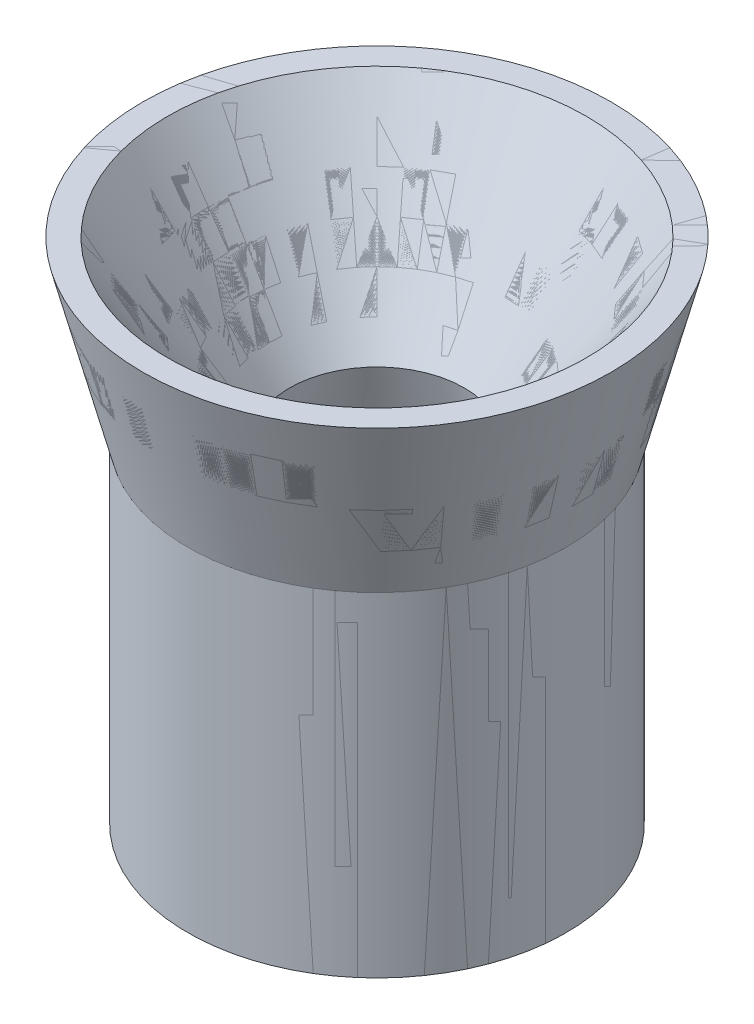
ISO-10303-21;
HEADER;
FILE_DESCRIPTION(('STEP AP214'),'2;1');
FILE_NAME('part.step','',(''),(''),'','','');
FILE_SCHEMA(('AUTOMOTIVE_DESIGN { 1 0 10303 214 1 1 1 1 }'));
ENDSEC;
DATA;
#1=APPLICATION_CONTEXT('core data for automotive mechanical design processes');
#2=APPLICATION_PROTOCOL_DEFINITION('international standard','automotive_design',2000,#1);
#3=PRODUCT_CONTEXT('',#1,'mechanical');
#4=PRODUCT('Part','Part','',(#3));
#5=PRODUCT_RELATED_PRODUCT_CATEGORY('part','',(#4));
#6=PRODUCT_DEFINITION_FORMATION('','',#4);
#7=PRODUCT_DEFINITION_CONTEXT('part definition',#1,'design');
#8=PRODUCT_DEFINITION('design','',#6,#7);
#9=PRODUCT_DEFINITION_SHAPE('','',#8);
#10=(LENGTH_UNIT() NAMED_UNIT(*) SI_UNIT(.MILLI.,.METRE.));
#11=(NAMED_UNIT(*) PLANE_ANGLE_UNIT() SI_UNIT($,.RADIAN.));
#12=(NAMED_UNIT(*) SI_UNIT($,.STERADIAN.) SOLID_ANGLE_UNIT());
#13=UNCERTAINTY_MEASURE_WITH_UNIT(LENGTH_MEASURE(1.E-05),#10,'distance_accuracy_value','');
#14=(GEOMETRIC_REPRESENTATION_CONTEXT(3) GLOBAL_UNCERTAINTY_ASSIGNED_CONTEXT((#13)) GLOBAL_UNIT_ASSIGNED_CONTEXT((#10,
#11,#12)) REPRESENTATION_CONTEXT('',''));
#15=CARTESIAN_POINT('',(0.,0.,0.));
#16=DIRECTION('',(0.,0.,1.));
#17=DIRECTION('',(1.,0.,0.));
#18=AXIS2_PLACEMENT_3D('',#15,#16,#17);
#19=CARTESIAN_POINT('',(0.,-76.2,0.));
#20=DIRECTION('',(0.,-1.,0.));
#21=DIRECTION('',(0.,0.,-1.));
#22=AXIS2_PLACEMENT_3D('',#19,#20,#21);
#23=CONICAL_SURFACE('',#22,36.1358099992551,0.209439510239313);
#24=CARTESIAN_POINT('',(0.,0.,0.));
#25=DIRECTION('',(0.,-1.,0.));
#26=DIRECTION('',(0.,0.,-1.));
#27=AXIS2_PLACEMENT_3D('',#24,#25,#26);
#28=CIRCLE('',#27,19.939);
#29=CARTESIAN_POINT('',(0.,0.,-19.939));
#30=VERTEX_POINT('',#29);
#31=EDGE_CURVE('E11',#30,#30,#28,.T.);
#32=ORIENTED_EDGE('',*,*,#31,.F.);
#33=EDGE_LOOP('',(#32));
#34=FACE_BOUND('',#33,.T.);
#35=CARTESIAN_POINT('',(0.,-76.2,0.));
#36=DIRECTION('',(0.,-1.,0.));
#37=DIRECTION('',(0.,0.,-1.));
#38=AXIS2_PLACEMENT_3D('',#35,#36,#37);
#39=CIRCLE('',#38,36.1358099992551);
#40=CARTESIAN_POINT('',(0.,-76.2,-36.1358099992551));
#41=VERTEX_POINT('',#40);
#42=EDGE_CURVE('E70',#41,#41,#39,.T.);
#43=ORIENTED_EDGE('',*,*,#42,.T.);
#44=EDGE_LOOP('',(#43));
#45=FACE_BOUND('',#44,.T.);
#46=ADVANCED_FACE('F48',(#34,#45),#23,.F.);
#47=CARTESIAN_POINT('',(0.,0.,0.));
#48=DIRECTION('',(0.,1.,0.));
#49=DIRECTION('',(0.,0.,1.));
#50=AXIS2_PLACEMENT_3D('',#47,#48,#49);
#51=CONICAL_SURFACE('',#50,19.939,0.610865238198017);
#52=CARTESIAN_POINT('',(0.,39.7879841001668,0.));
#53=DIRECTION('',(0.,-1.,0.));
#54=DIRECTION('',(0.,0.,-1.));
#55=AXIS2_PLACEMENT_3D('',#52,#53,#54);
#56=CIRCLE('',#55,47.798846397105);
#57=CARTESIAN_POINT('',(0.,39.7879841001668,-47.798846397105));
#58=VERTEX_POINT('',#57);
#59=EDGE_CURVE('E54',#58,#58,#56,.T.);
#60=ORIENTED_EDGE('',*,*,#59,.F.);
#61=EDGE_LOOP('',(#60));
#62=FACE_BOUND('',#61,.T.);
#63=ORIENTED_EDGE('',*,*,#31,.T.);
#64=EDGE_LOOP('',(#63));
#65=FACE_BOUND('',#64,.T.);
#66=ADVANCED_FACE('F95',(#62,#65),#51,.F.);
#67=CARTESIAN_POINT('',(-53.469872334376,39.7879841001669,0.));
#68=DIRECTION('',(0.,-1.,0.));
#69=DIRECTION('',(0.,0.,-1.));
#70=AXIS2_PLACEMENT_3D('',#67,#68,#69);
#71=PLANE('',#70);
#72=CARTESIAN_POINT('',(0.,39.7879841001669,0.));
#73=DIRECTION('',(0.,-1.,0.));
#74=DIRECTION('',(0.,0.,-1.));
#75=AXIS2_PLACEMENT_3D('',#72,#73,#74);
#76=CIRCLE('',#75,53.469872334376);
#77=CARTESIAN_POINT('',(0.,39.7879841001669,-53.469872334376));
#78=VERTEX_POINT('',#77);
#79=EDGE_CURVE('E58',#78,#78,#76,.T.);
#80=ORIENTED_EDGE('',*,*,#79,.F.);
#81=EDGE_LOOP('',(#80));
#82=FACE_BOUND('',#81,.T.);
#83=ORIENTED_EDGE('',*,*,#59,.T.);
#84=EDGE_LOOP('',(#83));
#85=FACE_BOUND('',#84,.T.);
#86=ADVANCED_FACE('F90',(#82,#85),#71,.F.);
#87=CARTESIAN_POINT('',(0.,39.7879841001669,0.));
#88=DIRECTION('',(0.,1.,0.));
#89=DIRECTION('',(0.,0.,1.));
#90=AXIS2_PLACEMENT_3D('',#87,#88,#89);
#91=CONICAL_SURFACE('',#90,53.469872334376,0.253072741539186);
#92=CARTESIAN_POINT('',(0.,0.,0.));
#93=DIRECTION('',(0.,-1.,0.));
#94=DIRECTION('',(0.,0.,-1.));
#95=AXIS2_PLACEMENT_3D('',#92,#93,#94);
#96=CIRCLE('',#95,43.18);
#97=CARTESIAN_POINT('',(0.,0.,-43.18));
#98=VERTEX_POINT('',#97);
#99=EDGE_CURVE('E62',#98,#98,#96,.T.);
#100=ORIENTED_EDGE('',*,*,#99,.F.);
#101=EDGE_LOOP('',(#100));
#102=FACE_BOUND('',#101,.T.);
#103=ORIENTED_EDGE('',*,*,#79,.T.);
#104=EDGE_LOOP('',(#103));
#105=FACE_BOUND('',#104,.T.);
#106=ADVANCED_FACE('F84',(#102,#105),#91,.T.);
#107=CARTESIAN_POINT('',(0.,0.,0.));
#108=DIRECTION('',(0.,-1.,0.));
#109=DIRECTION('',(0.,0.,-1.));
#110=AXIS2_PLACEMENT_3D('',#107,#108,#109);
#111=CYLINDRICAL_SURFACE('',#110,43.18);
#112=CARTESIAN_POINT('',(0.,-76.2,0.));
#113=DIRECTION('',(0.,-1.,0.));
#114=DIRECTION('',(0.,0.,-1.));
#115=AXIS2_PLACEMENT_3D('',#112,#113,#114);
#116=CIRCLE('',#115,43.18);
#117=CARTESIAN_POINT('',(0.,-76.2,-43.18));
#118=VERTEX_POINT('',#117);
#119=EDGE_CURVE('E67',#118,#118,#116,.T.);
#120=ORIENTED_EDGE('',*,*,#119,.F.);
#121=EDGE_LOOP('',(#120));
#122=FACE_BOUND('',#121,.T.);
#123=ORIENTED_EDGE('',*,*,#99,.T.);
#124=EDGE_LOOP('',(#123));
#125=FACE_BOUND('',#124,.T.);
#126=ADVANCED_FACE('F78',(#122,#125),#111,.T.);
#127=CARTESIAN_POINT('',(-43.18,-76.2,0.));
#128=DIRECTION('',(0.,1.,0.));
#129=DIRECTION('',(0.,0.,1.));
#130=AXIS2_PLACEMENT_3D('',#127,#128,#129);
#131=PLANE('',#130);
#132=ORIENTED_EDGE('',*,*,#42,.F.);
#133=EDGE_LOOP('',(#132));
#134=FACE_BOUND('',#133,.T.);
#135=ORIENTED_EDGE('',*,*,#119,.T.);
#136=EDGE_LOOP('',(#135));
#137=FACE_BOUND('',#136,.T.);
#138=ADVANCED_FACE('F75',(#134,#137),#131,.F.);
#139=CLOSED_SHELL('',(#46,#66,#86,#106,#126,#138));
#140=MANIFOLD_SOLID_BREP('B2',#139);
#141=CARTESIAN_POINT('',(0.,0.,0.));
#142=DIRECTION('',(0.,-1.,0.));
#143=DIRECTION('',(0.,0.,-1.));
#144=AXIS2_PLACEMENT_3D('',#141,#142,#143);
#145=CONICAL_SURFACE('',#144,19.939,0.209439510239313);
#146=CARTESIAN_POINT('',(0.,-76.2,0.));
#147=DIRECTION('',(0.,-1.,0.));
#148=DIRECTION('',(0.,0.,-1.));
#149=AXIS2_PLACEMENT_3D('',#146,#147,#148);
#150=CIRCLE('',#149,36.1358099992551);
#151=CARTESIAN_POINT('',(0.,-76.2,-36.1358099992551));
#152=VERTEX_POINT('',#151);
#153=EDGE_CURVE('E178',#152,#152,#150,.T.);
#154=ORIENTED_EDGE('',*,*,#153,.T.);
#155=EDGE_LOOP('',(#154));
#156=FACE_BOUND('',#155,.T.);
#157=CARTESIAN_POINT('',(0.,0.,0.));
#158=DIRECTION('',(0.,-1.,0.));
#159=DIRECTION('',(0.,0.,-1.));
#160=AXIS2_PLACEMENT_3D('',#157,#158,#159);
#161=CIRCLE('',#160,19.939);
#162=CARTESIAN_POINT('',(0.,0.,-19.939));
#163=VERTEX_POINT('',#162);
#164=EDGE_CURVE('E47',#163,#163,#161,.T.);
#165=ORIENTED_EDGE('',*,*,#164,.F.);
#166=EDGE_LOOP('',(#165));
#167=FACE_BOUND('',#166,.T.);
#168=ADVANCED_FACE('F151',(#156,#167),#145,.F.);
#169=CARTESIAN_POINT('',(0.,39.7879841001668,0.));
#170=DIRECTION('',(0.,1.,0.));
#171=DIRECTION('',(0.,0.,1.));
#172=AXIS2_PLACEMENT_3D('',#169,#170,#171);
#173=CONICAL_SURFACE('',#172,47.7988463971049,0.610865238198016);
#174=ORIENTED_EDGE('',*,*,#164,.T.);
#175=EDGE_LOOP('',(#174));
#176=FACE_BOUND('',#175,.T.);
#177=CARTESIAN_POINT('',(0.,39.7879841001668,0.));
#178=DIRECTION('',(0.,-1.,0.));
#179=DIRECTION('',(0.,0.,-1.));
#180=AXIS2_PLACEMENT_3D('',#177,#178,#179);
#181=CIRCLE('',#180,47.7988463971049);
#182=CARTESIAN_POINT('',(0.,39.7879841001668,-47.7988463971049));
#183=VERTEX_POINT('',#182);
#184=EDGE_CURVE('E158',#183,#183,#181,.T.);
#185=ORIENTED_EDGE('',*,*,#184,.F.);
#186=EDGE_LOOP('',(#185));
#187=FACE_BOUND('',#186,.T.);
#188=ADVANCED_FACE('F197',(#176,#187),#173,.F.);
#189=CARTESIAN_POINT('',(53.469872334376,39.7879841001669,0.));
#190=DIRECTION('',(0.,1.,0.));
#191=DIRECTION('',(0.,0.,1.));
#192=AXIS2_PLACEMENT_3D('',#189,#190,#191);
#193=PLANE('',#192);
#194=ORIENTED_EDGE('',*,*,#184,.T.);
#195=EDGE_LOOP('',(#194));
#196=FACE_BOUND('',#195,.T.);
#197=CARTESIAN_POINT('',(0.,39.7879841001669,0.));
#198=DIRECTION('',(0.,-1.,0.));
#199=DIRECTION('',(0.,0.,-1.));
#200=AXIS2_PLACEMENT_3D('',#197,#198,#199);
#201=CIRCLE('',#200,53.469872334376);
#202=CARTESIAN_POINT('',(0.,39.7879841001669,-53.469872334376));
#203=VERTEX_POINT('',#202);
#204=EDGE_CURVE('E163',#203,#203,#201,.T.);
#205=ORIENTED_EDGE('',*,*,#204,.F.);
#206=EDGE_LOOP('',(#205));
#207=FACE_BOUND('',#206,.T.);
#208=ADVANCED_FACE('F201',(#196,#207),#193,.T.);
#209=CARTESIAN_POINT('',(0.,0.,0.));
#210=DIRECTION('',(0.,1.,0.));
#211=DIRECTION('',(0.,0.,1.));
#212=AXIS2_PLACEMENT_3D('',#209,#210,#211);
#213=CONICAL_SURFACE('',#212,43.18,0.253072741539186);
#214=ORIENTED_EDGE('',*,*,#204,.T.);
#215=EDGE_LOOP('',(#214));
#216=FACE_BOUND('',#215,.T.);
#217=CARTESIAN_POINT('',(0.,0.,0.));
#218=DIRECTION('',(0.,-1.,0.));
#219=DIRECTION('',(0.,0.,-1.));
#220=AXIS2_PLACEMENT_3D('',#217,#218,#219);
#221=CIRCLE('',#220,43.18);
#222=CARTESIAN_POINT('',(0.,0.,-43.18));
#223=VERTEX_POINT('',#222);
#224=EDGE_CURVE('E168',#223,#223,#221,.T.);
#225=ORIENTED_EDGE('',*,*,#224,.F.);
#226=EDGE_LOOP('',(#225));
#227=FACE_BOUND('',#226,.T.);
#228=ADVANCED_FACE('F193',(#216,#227),#213,.T.);
#229=CARTESIAN_POINT('',(0.,0.,0.));
#230=DIRECTION('',(0.,-1.,0.));
#231=DIRECTION('',(0.,0.,-1.));
#232=AXIS2_PLACEMENT_3D('',#229,#230,#231);
#233=CYLINDRICAL_SURFACE('',#232,43.18);
#234=ORIENTED_EDGE('',*,*,#224,.T.);
#235=EDGE_LOOP('',(#234));
#236=FACE_BOUND('',#235,.T.);
#237=CARTESIAN_POINT('',(0.,-76.2,0.));
#238=DIRECTION('',(0.,-1.,0.));
#239=DIRECTION('',(0.,0.,-1.));
#240=AXIS2_PLACEMENT_3D('',#237,#238,#239);
#241=CIRCLE('',#240,43.18);
#242=CARTESIAN_POINT('',(0.,-76.2,-43.18));
#243=VERTEX_POINT('',#242);
#244=EDGE_CURVE('E174',#243,#243,#241,.T.);
#245=ORIENTED_EDGE('',*,*,#244,.F.);
#246=EDGE_LOOP('',(#245));
#247=FACE_BOUND('',#246,.T.);
#248=ADVANCED_FACE('F187',(#236,#247),#233,.T.);
#249=CARTESIAN_POINT('',(43.18,-76.2,0.));
#250=DIRECTION('',(0.,-1.,0.));
#251=DIRECTION('',(0.,0.,-1.));
#252=AXIS2_PLACEMENT_3D('',#249,#250,#251);
#253=PLANE('',#252);
#254=ORIENTED_EDGE('',*,*,#244,.T.);
#255=EDGE_LOOP('',(#254));
#256=FACE_BOUND('',#255,.T.);
#257=ORIENTED_EDGE('',*,*,#153,.F.);
#258=EDGE_LOOP('',(#257));
#259=FACE_BOUND('',#258,.T.);
#260=ADVANCED_FACE('F185',(#256,#259),#253,.T.);
#261=CLOSED_SHELL('',(#168,#188,#208,#228,#248,#260));
#262=MANIFOLD_SOLID_BREP('B6',#261);
#263=ADVANCED_BREP_SHAPE_REPRESENTATION('',(#18,#140,#262),#14);
#264=SHAPE_DEFINITION_REPRESENTATION(#9,#263);
ENDSEC;
END-ISO-10303-21;
